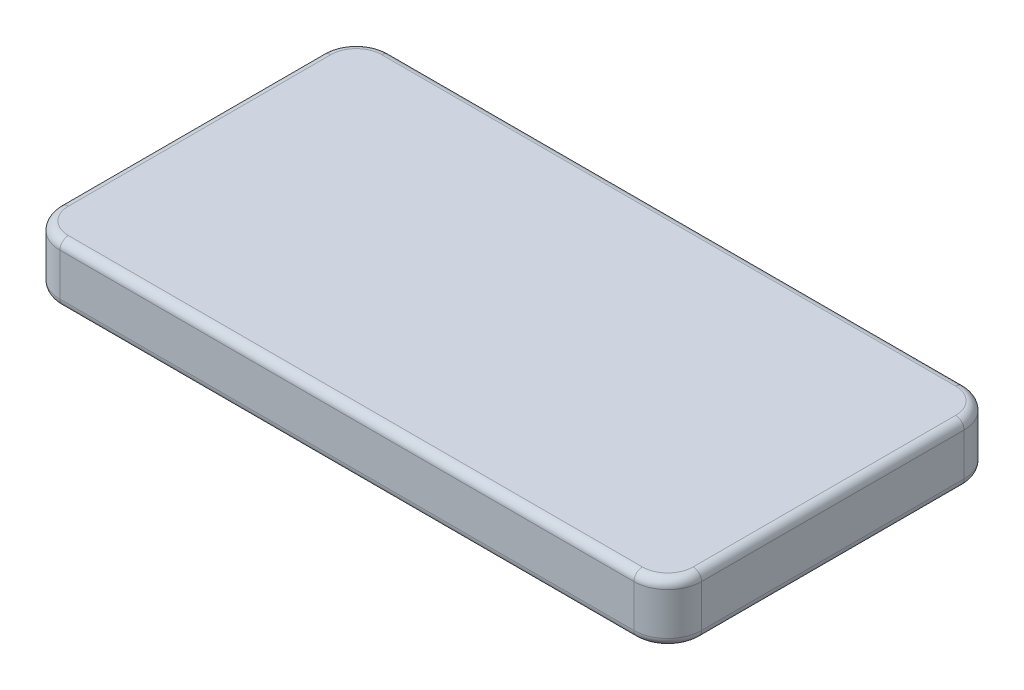
ISO-10303-21;
HEADER;
FILE_DESCRIPTION(('STEP AP214'),'2;1');
FILE_NAME('part.step','',(''),(''),'','','');
FILE_SCHEMA(('AUTOMOTIVE_DESIGN { 1 0 10303 214 1 1 1 1 }'));
ENDSEC;
DATA;
#1=APPLICATION_CONTEXT('core data for automotive mechanical design processes');
#2=APPLICATION_PROTOCOL_DEFINITION('international standard','automotive_design',2000,#1);
#3=PRODUCT_CONTEXT('',#1,'mechanical');
#4=PRODUCT('Part','Part','',(#3));
#5=PRODUCT_RELATED_PRODUCT_CATEGORY('part','',(#4));
#6=PRODUCT_DEFINITION_FORMATION('','',#4);
#7=PRODUCT_DEFINITION_CONTEXT('part definition',#1,'design');
#8=PRODUCT_DEFINITION('design','',#6,#7);
#9=PRODUCT_DEFINITION_SHAPE('','',#8);
#10=(LENGTH_UNIT() NAMED_UNIT(*) SI_UNIT(.MILLI.,.METRE.));
#11=(NAMED_UNIT(*) PLANE_ANGLE_UNIT() SI_UNIT($,.RADIAN.));
#12=(NAMED_UNIT(*) SI_UNIT($,.STERADIAN.) SOLID_ANGLE_UNIT());
#13=UNCERTAINTY_MEASURE_WITH_UNIT(LENGTH_MEASURE(1.E-05),#10,'distance_accuracy_value','');
#14=(GEOMETRIC_REPRESENTATION_CONTEXT(3) GLOBAL_UNCERTAINTY_ASSIGNED_CONTEXT((#13)) GLOBAL_UNIT_ASSIGNED_CONTEXT((#10,
#11,#12)) REPRESENTATION_CONTEXT('',''));
#15=CARTESIAN_POINT('',(0.,0.,0.));
#16=DIRECTION('',(0.,0.,1.));
#17=DIRECTION('',(1.,0.,0.));
#18=AXIS2_PLACEMENT_3D('',#15,#16,#17);
#19=CARTESIAN_POINT('',(48.133,4.445,24.765));
#20=DIRECTION('',(-1.,0.,0.));
#21=DIRECTION('',(0.,0.,1.));
#22=AXIS2_PLACEMENT_3D('',#19,#20,#21);
#23=PLANE('',#22);
#24=DIRECTION('',(0.,-1.,0.));
#25=VECTOR('',#24,1.);
#26=CARTESIAN_POINT('',(48.133,4.445,19.685));
#27=LINE('',#26,#25);
#28=CARTESIAN_POINT('',(48.133,3.175,19.685));
#29=VERTEX_POINT('',#28);
#30=CARTESIAN_POINT('',(48.133,-3.175,19.685));
#31=VERTEX_POINT('',#30);
#32=EDGE_CURVE('E350',#29,#31,#27,.T.);
#33=ORIENTED_EDGE('',*,*,#32,.T.);
#34=DIRECTION('',(0.,0.,-1.));
#35=VECTOR('',#34,1.);
#36=CARTESIAN_POINT('',(48.133,-3.175,-19.685));
#37=LINE('',#36,#35);
#38=CARTESIAN_POINT('',(48.133,-3.175,-19.685));
#39=VERTEX_POINT('',#38);
#40=EDGE_CURVE('E208',#31,#39,#37,.T.);
#41=ORIENTED_EDGE('',*,*,#40,.T.);
#42=DIRECTION('',(0.,-1.,0.));
#43=VECTOR('',#42,1.);
#44=CARTESIAN_POINT('',(48.133,4.445,-19.685));
#45=LINE('',#44,#43);
#46=CARTESIAN_POINT('',(48.133,3.175,-19.685));
#47=VERTEX_POINT('',#46);
#48=EDGE_CURVE('E175',#39,#47,#45,.F.);
#49=ORIENTED_EDGE('',*,*,#48,.T.);
#50=DIRECTION('',(0.,0.,-1.));
#51=VECTOR('',#50,1.);
#52=CARTESIAN_POINT('',(48.133,3.175,24.765));
#53=LINE('',#52,#51);
#54=EDGE_CURVE('E205',#47,#29,#53,.F.);
#55=ORIENTED_EDGE('',*,*,#54,.T.);
#56=EDGE_LOOP('',(#33,#41,#49,#55));
#57=FACE_BOUND('',#56,.T.);
#58=ADVANCED_FACE('F39',(#57),#23,.F.);
#59=CARTESIAN_POINT('',(-48.133,4.445,-24.765));
#60=DIRECTION('',(0.,0.,1.));
#61=DIRECTION('',(1.,0.,0.));
#62=AXIS2_PLACEMENT_3D('',#59,#60,#61);
#63=PLANE('',#62);
#64=DIRECTION('',(0.,-1.,0.));
#65=VECTOR('',#64,1.);
#66=CARTESIAN_POINT('',(43.053,4.445,-24.765));
#67=LINE('',#66,#65);
#68=CARTESIAN_POINT('',(43.053,3.175,-24.765));
#69=VERTEX_POINT('',#68);
#70=CARTESIAN_POINT('',(43.053,-3.175,-24.765));
#71=VERTEX_POINT('',#70);
#72=EDGE_CURVE('E334',#69,#71,#67,.T.);
#73=ORIENTED_EDGE('',*,*,#72,.T.);
#74=DIRECTION('',(-1.,0.,0.));
#75=VECTOR('',#74,1.);
#76=CARTESIAN_POINT('',(-43.053,-3.175,-24.765));
#77=LINE('',#76,#75);
#78=CARTESIAN_POINT('',(-43.053,-3.175,-24.765));
#79=VERTEX_POINT('',#78);
#80=EDGE_CURVE('E221',#71,#79,#77,.T.);
#81=ORIENTED_EDGE('',*,*,#80,.T.);
#82=DIRECTION('',(0.,-1.,0.));
#83=VECTOR('',#82,1.);
#84=CARTESIAN_POINT('',(-43.053,4.445,-24.765));
#85=LINE('',#84,#83);
#86=CARTESIAN_POINT('',(-43.053,3.175,-24.765));
#87=VERTEX_POINT('',#86);
#88=EDGE_CURVE('E340',#79,#87,#85,.F.);
#89=ORIENTED_EDGE('',*,*,#88,.T.);
#90=DIRECTION('',(-1.,0.,0.));
#91=VECTOR('',#90,1.);
#92=CARTESIAN_POINT('',(-48.133,3.175,-24.765));
#93=LINE('',#92,#91);
#94=EDGE_CURVE('E218',#87,#69,#93,.F.);
#95=ORIENTED_EDGE('',*,*,#94,.T.);
#96=EDGE_LOOP('',(#73,#81,#89,#95));
#97=FACE_BOUND('',#96,.T.);
#98=ADVANCED_FACE('F408',(#97),#63,.F.);
#99=CARTESIAN_POINT('',(-48.133,4.445,24.765));
#100=DIRECTION('',(1.,0.,0.));
#101=DIRECTION('',(0.,0.,-1.));
#102=AXIS2_PLACEMENT_3D('',#99,#100,#101);
#103=PLANE('',#102);
#104=DIRECTION('',(0.,-1.,0.));
#105=VECTOR('',#104,1.);
#106=CARTESIAN_POINT('',(-48.133,4.445,-19.685));
#107=LINE('',#106,#105);
#108=CARTESIAN_POINT('',(-48.133,3.175,-19.685));
#109=VERTEX_POINT('',#108);
#110=CARTESIAN_POINT('',(-48.133,-3.175,-19.685));
#111=VERTEX_POINT('',#110);
#112=EDGE_CURVE('E331',#109,#111,#107,.T.);
#113=ORIENTED_EDGE('',*,*,#112,.T.);
#114=DIRECTION('',(0.,0.,1.));
#115=VECTOR('',#114,1.);
#116=CARTESIAN_POINT('',(-48.133,-3.175,19.685));
#117=LINE('',#116,#115);
#118=CARTESIAN_POINT('',(-48.133,-3.175,19.685));
#119=VERTEX_POINT('',#118);
#120=EDGE_CURVE('E233',#111,#119,#117,.T.);
#121=ORIENTED_EDGE('',*,*,#120,.T.);
#122=DIRECTION('',(0.,-1.,0.));
#123=VECTOR('',#122,1.);
#124=CARTESIAN_POINT('',(-48.133,4.445,19.685));
#125=LINE('',#124,#123);
#126=CARTESIAN_POINT('',(-48.133,3.175,19.685));
#127=VERTEX_POINT('',#126);
#128=EDGE_CURVE('E279',#119,#127,#125,.F.);
#129=ORIENTED_EDGE('',*,*,#128,.T.);
#130=DIRECTION('',(0.,0.,1.));
#131=VECTOR('',#130,1.);
#132=CARTESIAN_POINT('',(-48.133,3.175,24.765));
#133=LINE('',#132,#131);
#134=EDGE_CURVE('E230',#127,#109,#133,.F.);
#135=ORIENTED_EDGE('',*,*,#134,.T.);
#136=EDGE_LOOP('',(#113,#121,#129,#135));
#137=FACE_BOUND('',#136,.T.);
#138=ADVANCED_FACE('F328',(#137),#103,.F.);
#139=CARTESIAN_POINT('',(-48.133,4.445,24.765));
#140=DIRECTION('',(0.,0.,-1.));
#141=DIRECTION('',(-1.,0.,0.));
#142=AXIS2_PLACEMENT_3D('',#139,#140,#141);
#143=PLANE('',#142);
#144=DIRECTION('',(0.,-1.,0.));
#145=VECTOR('',#144,1.);
#146=CARTESIAN_POINT('',(-43.053,4.445,24.765));
#147=LINE('',#146,#145);
#148=CARTESIAN_POINT('',(-43.053,3.175,24.765));
#149=VERTEX_POINT('',#148);
#150=CARTESIAN_POINT('',(-43.053,-3.175,24.765));
#151=VERTEX_POINT('',#150);
#152=EDGE_CURVE('E325',#149,#151,#147,.T.);
#153=ORIENTED_EDGE('',*,*,#152,.T.);
#154=DIRECTION('',(1.,0.,0.));
#155=VECTOR('',#154,1.);
#156=CARTESIAN_POINT('',(43.053,-3.175,24.765));
#157=LINE('',#156,#155);
#158=CARTESIAN_POINT('',(43.053,-3.175,24.765));
#159=VERTEX_POINT('',#158);
#160=EDGE_CURVE('E196',#151,#159,#157,.T.);
#161=ORIENTED_EDGE('',*,*,#160,.T.);
#162=DIRECTION('',(0.,-1.,0.));
#163=VECTOR('',#162,1.);
#164=CARTESIAN_POINT('',(43.053,4.445,24.765));
#165=LINE('',#164,#163);
#166=CARTESIAN_POINT('',(43.053,3.175,24.765));
#167=VERTEX_POINT('',#166);
#168=EDGE_CURVE('E344',#159,#167,#165,.F.);
#169=ORIENTED_EDGE('',*,*,#168,.T.);
#170=DIRECTION('',(1.,0.,0.));
#171=VECTOR('',#170,1.);
#172=CARTESIAN_POINT('',(-48.133,3.175,24.765));
#173=LINE('',#172,#171);
#174=EDGE_CURVE('E193',#167,#149,#173,.F.);
#175=ORIENTED_EDGE('',*,*,#174,.T.);
#176=EDGE_LOOP('',(#153,#161,#169,#175));
#177=FACE_BOUND('',#176,.T.);
#178=ADVANCED_FACE('F380',(#177),#143,.F.);
#179=CARTESIAN_POINT('',(0.,4.445,0.));
#180=DIRECTION('',(0.,-1.,0.));
#181=DIRECTION('',(0.,0.,-1.));
#182=AXIS2_PLACEMENT_3D('',#179,#180,#181);
#183=PLANE('',#182);
#184=DIRECTION('',(0.,0.,-1.));
#185=VECTOR('',#184,1.);
#186=CARTESIAN_POINT('',(46.863,4.445,0.));
#187=LINE('',#186,#185);
#188=CARTESIAN_POINT('',(46.863,4.445,19.685));
#189=VERTEX_POINT('',#188);
#190=CARTESIAN_POINT('',(46.863,4.445,-19.685));
#191=VERTEX_POINT('',#190);
#192=EDGE_CURVE('E49',#189,#191,#187,.T.);
#193=ORIENTED_EDGE('',*,*,#192,.T.);
#194=CARTESIAN_POINT('',(43.053,4.445,-19.685));
#195=DIRECTION('',(0.,-1.,0.));
#196=DIRECTION('',(0.,0.,-1.));
#197=AXIS2_PLACEMENT_3D('',#194,#195,#196);
#198=CIRCLE('',#197,3.81);
#199=CARTESIAN_POINT('',(43.053,4.445,-23.495));
#200=VERTEX_POINT('',#199);
#201=EDGE_CURVE('E11',#191,#200,#198,.F.);
#202=ORIENTED_EDGE('',*,*,#201,.T.);
#203=DIRECTION('',(-1.,0.,0.));
#204=VECTOR('',#203,1.);
#205=CARTESIAN_POINT('',(0.,4.445,-23.495));
#206=LINE('',#205,#204);
#207=CARTESIAN_POINT('',(-43.053,4.445,-23.495));
#208=VERTEX_POINT('',#207);
#209=EDGE_CURVE('E236',#200,#208,#206,.T.);
#210=ORIENTED_EDGE('',*,*,#209,.T.);
#211=CARTESIAN_POINT('',(-43.053,4.445,-19.685));
#212=DIRECTION('',(0.,-1.,0.));
#213=DIRECTION('',(0.,0.,-1.));
#214=AXIS2_PLACEMENT_3D('',#211,#212,#213);
#215=CIRCLE('',#214,3.81);
#216=CARTESIAN_POINT('',(-46.863,4.445,-19.685));
#217=VERTEX_POINT('',#216);
#218=EDGE_CURVE('E239',#208,#217,#215,.F.);
#219=ORIENTED_EDGE('',*,*,#218,.T.);
#220=DIRECTION('',(0.,0.,1.));
#221=VECTOR('',#220,1.);
#222=CARTESIAN_POINT('',(-46.863,4.445,0.));
#223=LINE('',#222,#221);
#224=CARTESIAN_POINT('',(-46.863,4.445,19.685));
#225=VERTEX_POINT('',#224);
#226=EDGE_CURVE('E242',#217,#225,#223,.T.);
#227=ORIENTED_EDGE('',*,*,#226,.T.);
#228=CARTESIAN_POINT('',(-43.053,4.445,19.685));
#229=DIRECTION('',(0.,-1.,0.));
#230=DIRECTION('',(0.,0.,-1.));
#231=AXIS2_PLACEMENT_3D('',#228,#229,#230);
#232=CIRCLE('',#231,3.81);
#233=CARTESIAN_POINT('',(-43.053,4.445,23.495));
#234=VERTEX_POINT('',#233);
#235=EDGE_CURVE('E245',#225,#234,#232,.F.);
#236=ORIENTED_EDGE('',*,*,#235,.T.);
#237=DIRECTION('',(1.,0.,0.));
#238=VECTOR('',#237,1.);
#239=CARTESIAN_POINT('',(0.,4.445,23.495));
#240=LINE('',#239,#238);
#241=CARTESIAN_POINT('',(43.053,4.445,23.495));
#242=VERTEX_POINT('',#241);
#243=EDGE_CURVE('E248',#234,#242,#240,.T.);
#244=ORIENTED_EDGE('',*,*,#243,.T.);
#245=CARTESIAN_POINT('',(43.053,4.445,19.685));
#246=DIRECTION('',(0.,-1.,0.));
#247=DIRECTION('',(0.,0.,-1.));
#248=AXIS2_PLACEMENT_3D('',#245,#246,#247);
#249=CIRCLE('',#248,3.81);
#250=EDGE_CURVE('E60',#242,#189,#249,.F.);
#251=ORIENTED_EDGE('',*,*,#250,.T.);
#252=EDGE_LOOP('',(#193,#202,#210,#219,#227,#236,#244,#251));
#253=FACE_BOUND('',#252,.T.);
#254=ADVANCED_FACE('F396',(#253),#183,.F.);
#255=CARTESIAN_POINT('',(0.,-4.445,0.));
#256=DIRECTION('',(0.,-1.,0.));
#257=DIRECTION('',(0.,0.,-1.));
#258=AXIS2_PLACEMENT_3D('',#255,#256,#257);
#259=PLANE('',#258);
#260=DIRECTION('',(1.,0.,0.));
#261=VECTOR('',#260,1.);
#262=CARTESIAN_POINT('',(-43.053,-4.445,23.495));
#263=LINE('',#262,#261);
#264=CARTESIAN_POINT('',(43.053,-4.445,23.495));
#265=VERTEX_POINT('',#264);
#266=CARTESIAN_POINT('',(-43.053,-4.445,23.495));
#267=VERTEX_POINT('',#266);
#268=EDGE_CURVE('E179',#265,#267,#263,.F.);
#269=ORIENTED_EDGE('',*,*,#268,.T.);
#270=CARTESIAN_POINT('',(-43.053,-4.445,19.685));
#271=DIRECTION('',(0.,-1.,0.));
#272=DIRECTION('',(0.,0.,-1.));
#273=AXIS2_PLACEMENT_3D('',#270,#271,#272);
#274=CIRCLE('',#273,3.81);
#275=CARTESIAN_POINT('',(-46.863,-4.445,19.685));
#276=VERTEX_POINT('',#275);
#277=EDGE_CURVE('E158',#267,#276,#274,.T.);
#278=ORIENTED_EDGE('',*,*,#277,.T.);
#279=DIRECTION('',(0.,0.,1.));
#280=VECTOR('',#279,1.);
#281=CARTESIAN_POINT('',(-46.863,-4.445,-19.685));
#282=LINE('',#281,#280);
#283=CARTESIAN_POINT('',(-46.863,-4.445,-19.685));
#284=VERTEX_POINT('',#283);
#285=EDGE_CURVE('E167',#276,#284,#282,.F.);
#286=ORIENTED_EDGE('',*,*,#285,.T.);
#287=CARTESIAN_POINT('',(-43.053,-4.445,-19.685));
#288=DIRECTION('',(0.,-1.,0.));
#289=DIRECTION('',(0.,0.,-1.));
#290=AXIS2_PLACEMENT_3D('',#287,#288,#289);
#291=CIRCLE('',#290,3.81);
#292=CARTESIAN_POINT('',(-43.053,-4.445,-23.495));
#293=VERTEX_POINT('',#292);
#294=EDGE_CURVE('E174',#284,#293,#291,.T.);
#295=ORIENTED_EDGE('',*,*,#294,.T.);
#296=DIRECTION('',(-1.,0.,0.));
#297=VECTOR('',#296,1.);
#298=CARTESIAN_POINT('',(43.053,-4.445,-23.495));
#299=LINE('',#298,#297);
#300=CARTESIAN_POINT('',(43.053,-4.445,-23.495));
#301=VERTEX_POINT('',#300);
#302=EDGE_CURVE('E359',#293,#301,#299,.F.);
#303=ORIENTED_EDGE('',*,*,#302,.T.);
#304=CARTESIAN_POINT('',(43.053,-4.445,-19.685));
#305=DIRECTION('',(0.,-1.,0.));
#306=DIRECTION('',(0.,0.,-1.));
#307=AXIS2_PLACEMENT_3D('',#304,#305,#306);
#308=CIRCLE('',#307,3.81);
#309=CARTESIAN_POINT('',(46.863,-4.445,-19.685));
#310=VERTEX_POINT('',#309);
#311=EDGE_CURVE('E362',#301,#310,#308,.T.);
#312=ORIENTED_EDGE('',*,*,#311,.T.);
#313=DIRECTION('',(0.,0.,-1.));
#314=VECTOR('',#313,1.);
#315=CARTESIAN_POINT('',(46.863,-4.445,19.685));
#316=LINE('',#315,#314);
#317=CARTESIAN_POINT('',(46.863,-4.445,19.685));
#318=VERTEX_POINT('',#317);
#319=EDGE_CURVE('E365',#310,#318,#316,.F.);
#320=ORIENTED_EDGE('',*,*,#319,.T.);
#321=CARTESIAN_POINT('',(43.053,-4.445,19.685));
#322=DIRECTION('',(0.,-1.,0.));
#323=DIRECTION('',(0.,0.,-1.));
#324=AXIS2_PLACEMENT_3D('',#321,#322,#323);
#325=CIRCLE('',#324,3.81);
#326=EDGE_CURVE('E187',#318,#265,#325,.T.);
#327=ORIENTED_EDGE('',*,*,#326,.T.);
#328=EDGE_LOOP('',(#269,#278,#286,#295,#303,#312,#320,#327));
#329=FACE_BOUND('',#328,.T.);
#330=ADVANCED_FACE('F177',(#329),#259,.T.);
#331=CARTESIAN_POINT('',(-43.053,4.445,-19.685));
#332=DIRECTION('',(0.,-1.,0.));
#333=DIRECTION('',(0.,0.,-1.));
#334=AXIS2_PLACEMENT_3D('',#331,#332,#333);
#335=CYLINDRICAL_SURFACE('',#334,5.08);
#336=ORIENTED_EDGE('',*,*,#88,.F.);
#337=CARTESIAN_POINT('',(-43.053,-3.175,-19.685));
#338=DIRECTION('',(0.,-1.,0.));
#339=DIRECTION('',(0.,0.,-1.));
#340=AXIS2_PLACEMENT_3D('',#337,#338,#339);
#341=CIRCLE('',#340,5.08);
#342=EDGE_CURVE('E227',#79,#111,#341,.F.);
#343=ORIENTED_EDGE('',*,*,#342,.T.);
#344=ORIENTED_EDGE('',*,*,#112,.F.);
#345=CARTESIAN_POINT('',(-43.053,3.175,-19.685));
#346=DIRECTION('',(0.,-1.,0.));
#347=DIRECTION('',(0.,0.,-1.));
#348=AXIS2_PLACEMENT_3D('',#345,#346,#347);
#349=CIRCLE('',#348,5.08);
#350=EDGE_CURVE('E224',#109,#87,#349,.T.);
#351=ORIENTED_EDGE('',*,*,#350,.T.);
#352=EDGE_LOOP('',(#336,#343,#344,#351));
#353=FACE_BOUND('',#352,.T.);
#354=ADVANCED_FACE('F432',(#353),#335,.T.);
#355=CARTESIAN_POINT('',(-43.053,4.445,19.685));
#356=DIRECTION('',(0.,-1.,0.));
#357=DIRECTION('',(0.,0.,-1.));
#358=AXIS2_PLACEMENT_3D('',#355,#356,#357);
#359=CYLINDRICAL_SURFACE('',#358,5.08);
#360=ORIENTED_EDGE('',*,*,#128,.F.);
#361=CARTESIAN_POINT('',(-43.053,-3.175,19.685));
#362=DIRECTION('',(0.,-1.,0.));
#363=DIRECTION('',(0.,0.,-1.));
#364=AXIS2_PLACEMENT_3D('',#361,#362,#363);
#365=CIRCLE('',#364,5.08);
#366=EDGE_CURVE('E160',#119,#151,#365,.F.);
#367=ORIENTED_EDGE('',*,*,#366,.T.);
#368=ORIENTED_EDGE('',*,*,#152,.F.);
#369=CARTESIAN_POINT('',(-43.053,3.175,19.685));
#370=DIRECTION('',(0.,-1.,0.));
#371=DIRECTION('',(0.,0.,-1.));
#372=AXIS2_PLACEMENT_3D('',#369,#370,#371);
#373=CIRCLE('',#372,5.08);
#374=EDGE_CURVE('E182',#149,#127,#373,.T.);
#375=ORIENTED_EDGE('',*,*,#374,.T.);
#376=EDGE_LOOP('',(#360,#367,#368,#375));
#377=FACE_BOUND('',#376,.T.);
#378=ADVANCED_FACE('F323',(#377),#359,.T.);
#379=CARTESIAN_POINT('',(43.053,4.445,-19.685));
#380=DIRECTION('',(0.,-1.,0.));
#381=DIRECTION('',(0.,0.,-1.));
#382=AXIS2_PLACEMENT_3D('',#379,#380,#381);
#383=CYLINDRICAL_SURFACE('',#382,5.08);
#384=ORIENTED_EDGE('',*,*,#48,.F.);
#385=CARTESIAN_POINT('',(43.053,-3.175,-19.685));
#386=DIRECTION('',(0.,-1.,0.));
#387=DIRECTION('',(0.,0.,-1.));
#388=AXIS2_PLACEMENT_3D('',#385,#386,#387);
#389=CIRCLE('',#388,5.08);
#390=EDGE_CURVE('E215',#39,#71,#389,.F.);
#391=ORIENTED_EDGE('',*,*,#390,.T.);
#392=ORIENTED_EDGE('',*,*,#72,.F.);
#393=CARTESIAN_POINT('',(43.053,3.175,-19.685));
#394=DIRECTION('',(0.,-1.,0.));
#395=DIRECTION('',(0.,0.,-1.));
#396=AXIS2_PLACEMENT_3D('',#393,#394,#395);
#397=CIRCLE('',#396,5.08);
#398=EDGE_CURVE('E211',#69,#47,#397,.T.);
#399=ORIENTED_EDGE('',*,*,#398,.T.);
#400=EDGE_LOOP('',(#384,#391,#392,#399));
#401=FACE_BOUND('',#400,.T.);
#402=ADVANCED_FACE('F413',(#401),#383,.T.);
#403=CARTESIAN_POINT('',(43.053,4.445,19.685));
#404=DIRECTION('',(0.,-1.,0.));
#405=DIRECTION('',(0.,0.,-1.));
#406=AXIS2_PLACEMENT_3D('',#403,#404,#405);
#407=CYLINDRICAL_SURFACE('',#406,5.08);
#408=ORIENTED_EDGE('',*,*,#168,.F.);
#409=CARTESIAN_POINT('',(43.053,-3.175,19.685));
#410=DIRECTION('',(0.,-1.,0.));
#411=DIRECTION('',(0.,0.,-1.));
#412=AXIS2_PLACEMENT_3D('',#409,#410,#411);
#413=CIRCLE('',#412,5.08);
#414=EDGE_CURVE('E202',#159,#31,#413,.F.);
#415=ORIENTED_EDGE('',*,*,#414,.T.);
#416=ORIENTED_EDGE('',*,*,#32,.F.);
#417=CARTESIAN_POINT('',(43.053,3.175,19.685));
#418=DIRECTION('',(0.,-1.,0.));
#419=DIRECTION('',(0.,0.,-1.));
#420=AXIS2_PLACEMENT_3D('',#417,#418,#419);
#421=CIRCLE('',#420,5.08);
#422=EDGE_CURVE('E199',#29,#167,#421,.T.);
#423=ORIENTED_EDGE('',*,*,#422,.T.);
#424=EDGE_LOOP('',(#408,#415,#416,#423));
#425=FACE_BOUND('',#424,.T.);
#426=ADVANCED_FACE('F382',(#425),#407,.T.);
#427=CARTESIAN_POINT('',(43.053,-3.175,-19.685));
#428=DIRECTION('',(0.,-1.,0.));
#429=DIRECTION('',(0.,0.,-1.));
#430=AXIS2_PLACEMENT_3D('',#427,#428,#429);
#431=TOROIDAL_SURFACE('',#430,3.81,1.27);
#432=CARTESIAN_POINT('',(43.053,-3.175,-23.495));
#433=DIRECTION('',(-1.,0.,0.));
#434=DIRECTION('',(0.,0.,1.));
#435=AXIS2_PLACEMENT_3D('',#432,#433,#434);
#436=CIRCLE('',#435,1.27);
#437=EDGE_CURVE('E271',#71,#301,#436,.T.);
#438=ORIENTED_EDGE('',*,*,#437,.F.);
#439=ORIENTED_EDGE('',*,*,#390,.F.);
#440=CARTESIAN_POINT('',(46.863,-3.175,-19.685));
#441=DIRECTION('',(0.,0.,1.));
#442=DIRECTION('',(1.,0.,0.));
#443=AXIS2_PLACEMENT_3D('',#440,#441,#442);
#444=CIRCLE('',#443,1.27);
#445=EDGE_CURVE('E275',#310,#39,#444,.T.);
#446=ORIENTED_EDGE('',*,*,#445,.F.);
#447=ORIENTED_EDGE('',*,*,#311,.F.);
#448=EDGE_LOOP('',(#438,#439,#446,#447));
#449=FACE_BOUND('',#448,.T.);
#450=ADVANCED_FACE('F417',(#449),#431,.T.);
#451=CARTESIAN_POINT('',(46.863,-3.175,24.765));
#452=DIRECTION('',(0.,0.,1.));
#453=DIRECTION('',(1.,0.,0.));
#454=AXIS2_PLACEMENT_3D('',#451,#452,#453);
#455=CYLINDRICAL_SURFACE('',#454,1.27);
#456=ORIENTED_EDGE('',*,*,#445,.T.);
#457=ORIENTED_EDGE('',*,*,#40,.F.);
#458=CARTESIAN_POINT('',(46.863,-3.175,19.685));
#459=DIRECTION('',(0.,0.,1.));
#460=DIRECTION('',(1.,0.,0.));
#461=AXIS2_PLACEMENT_3D('',#458,#459,#460);
#462=CIRCLE('',#461,1.27);
#463=EDGE_CURVE('E267',#318,#31,#462,.T.);
#464=ORIENTED_EDGE('',*,*,#463,.F.);
#465=ORIENTED_EDGE('',*,*,#319,.F.);
#466=EDGE_LOOP('',(#456,#457,#464,#465));
#467=FACE_BOUND('',#466,.T.);
#468=ADVANCED_FACE('F422',(#467),#455,.T.);
#469=CARTESIAN_POINT('',(-48.133,-3.175,-23.495));
#470=DIRECTION('',(1.,0.,0.));
#471=DIRECTION('',(0.,0.,-1.));
#472=AXIS2_PLACEMENT_3D('',#469,#470,#471);
#473=CYLINDRICAL_SURFACE('',#472,1.27);
#474=ORIENTED_EDGE('',*,*,#437,.T.);
#475=ORIENTED_EDGE('',*,*,#302,.F.);
#476=CARTESIAN_POINT('',(-43.053,-3.175,-23.495));
#477=DIRECTION('',(-1.,0.,0.));
#478=DIRECTION('',(0.,0.,1.));
#479=AXIS2_PLACEMENT_3D('',#476,#477,#478);
#480=CIRCLE('',#479,1.27);
#481=EDGE_CURVE('E263',#79,#293,#480,.T.);
#482=ORIENTED_EDGE('',*,*,#481,.F.);
#483=ORIENTED_EDGE('',*,*,#80,.F.);
#484=EDGE_LOOP('',(#474,#475,#482,#483));
#485=FACE_BOUND('',#484,.T.);
#486=ADVANCED_FACE('F454',(#485),#473,.T.);
#487=CARTESIAN_POINT('',(43.053,-3.175,19.685));
#488=DIRECTION('',(0.,-1.,0.));
#489=DIRECTION('',(0.,0.,-1.));
#490=AXIS2_PLACEMENT_3D('',#487,#488,#489);
#491=TOROIDAL_SURFACE('',#490,3.81,1.27);
#492=ORIENTED_EDGE('',*,*,#463,.T.);
#493=ORIENTED_EDGE('',*,*,#414,.F.);
#494=CARTESIAN_POINT('',(43.053,-3.175,23.495));
#495=DIRECTION('',(-1.,0.,0.));
#496=DIRECTION('',(0.,0.,1.));
#497=AXIS2_PLACEMENT_3D('',#494,#495,#496);
#498=CIRCLE('',#497,1.27);
#499=EDGE_CURVE('E259',#265,#159,#498,.T.);
#500=ORIENTED_EDGE('',*,*,#499,.F.);
#501=ORIENTED_EDGE('',*,*,#326,.F.);
#502=EDGE_LOOP('',(#492,#493,#500,#501));
#503=FACE_BOUND('',#502,.T.);
#504=ADVANCED_FACE('F374',(#503),#491,.T.);
#505=CARTESIAN_POINT('',(-43.053,-3.175,-19.685));
#506=DIRECTION('',(0.,-1.,0.));
#507=DIRECTION('',(0.,0.,-1.));
#508=AXIS2_PLACEMENT_3D('',#505,#506,#507);
#509=TOROIDAL_SURFACE('',#508,3.81,1.27);
#510=ORIENTED_EDGE('',*,*,#481,.T.);
#511=ORIENTED_EDGE('',*,*,#294,.F.);
#512=CARTESIAN_POINT('',(-46.863,-3.175,-19.685));
#513=DIRECTION('',(0.,0.,1.));
#514=DIRECTION('',(1.,0.,0.));
#515=AXIS2_PLACEMENT_3D('',#512,#513,#514);
#516=CIRCLE('',#515,1.27);
#517=EDGE_CURVE('E170',#111,#284,#516,.T.);
#518=ORIENTED_EDGE('',*,*,#517,.F.);
#519=ORIENTED_EDGE('',*,*,#342,.F.);
#520=EDGE_LOOP('',(#510,#511,#518,#519));
#521=FACE_BOUND('',#520,.T.);
#522=ADVANCED_FACE('F448',(#521),#509,.T.);
#523=CARTESIAN_POINT('',(-48.133,-3.175,23.495));
#524=DIRECTION('',(-1.,0.,0.));
#525=DIRECTION('',(0.,0.,1.));
#526=AXIS2_PLACEMENT_3D('',#523,#524,#525);
#527=CYLINDRICAL_SURFACE('',#526,1.27);
#528=ORIENTED_EDGE('',*,*,#499,.T.);
#529=ORIENTED_EDGE('',*,*,#160,.F.);
#530=CARTESIAN_POINT('',(-43.053,-3.175,23.495));
#531=DIRECTION('',(-1.,0.,0.));
#532=DIRECTION('',(0.,0.,1.));
#533=AXIS2_PLACEMENT_3D('',#530,#531,#532);
#534=CIRCLE('',#533,1.27);
#535=EDGE_CURVE('E164',#267,#151,#534,.T.);
#536=ORIENTED_EDGE('',*,*,#535,.F.);
#537=ORIENTED_EDGE('',*,*,#268,.F.);
#538=EDGE_LOOP('',(#528,#529,#536,#537));
#539=FACE_BOUND('',#538,.T.);
#540=ADVANCED_FACE('F377',(#539),#527,.T.);
#541=CARTESIAN_POINT('',(-46.863,-3.175,24.765));
#542=DIRECTION('',(0.,0.,-1.));
#543=DIRECTION('',(-1.,0.,0.));
#544=AXIS2_PLACEMENT_3D('',#541,#542,#543);
#545=CYLINDRICAL_SURFACE('',#544,1.27);
#546=ORIENTED_EDGE('',*,*,#517,.T.);
#547=ORIENTED_EDGE('',*,*,#285,.F.);
#548=CARTESIAN_POINT('',(-46.863,-3.175,19.685));
#549=DIRECTION('',(0.,0.,1.));
#550=DIRECTION('',(1.,0.,0.));
#551=AXIS2_PLACEMENT_3D('',#548,#549,#550);
#552=CIRCLE('',#551,1.27);
#553=EDGE_CURVE('E154',#119,#276,#552,.T.);
#554=ORIENTED_EDGE('',*,*,#553,.F.);
#555=ORIENTED_EDGE('',*,*,#120,.F.);
#556=EDGE_LOOP('',(#546,#547,#554,#555));
#557=FACE_BOUND('',#556,.T.);
#558=ADVANCED_FACE('F168',(#557),#545,.T.);
#559=CARTESIAN_POINT('',(-43.053,-3.175,19.685));
#560=DIRECTION('',(0.,-1.,0.));
#561=DIRECTION('',(0.,0.,-1.));
#562=AXIS2_PLACEMENT_3D('',#559,#560,#561);
#563=TOROIDAL_SURFACE('',#562,3.81,1.27);
#564=ORIENTED_EDGE('',*,*,#535,.T.);
#565=ORIENTED_EDGE('',*,*,#366,.F.);
#566=ORIENTED_EDGE('',*,*,#553,.T.);
#567=ORIENTED_EDGE('',*,*,#277,.F.);
#568=EDGE_LOOP('',(#564,#565,#566,#567));
#569=FACE_BOUND('',#568,.T.);
#570=ADVANCED_FACE('F156',(#569),#563,.T.);
#571=CARTESIAN_POINT('',(-43.053,3.175,19.685));
#572=DIRECTION('',(0.,-1.,0.));
#573=DIRECTION('',(0.,0.,-1.));
#574=AXIS2_PLACEMENT_3D('',#571,#572,#573);
#575=TOROIDAL_SURFACE('',#574,3.81,1.27);
#576=CARTESIAN_POINT('',(-46.863,3.175,19.685));
#577=DIRECTION('',(0.,0.,-1.));
#578=DIRECTION('',(-1.,0.,0.));
#579=AXIS2_PLACEMENT_3D('',#576,#577,#578);
#580=CIRCLE('',#579,1.27);
#581=EDGE_CURVE('E301',#127,#225,#580,.T.);
#582=ORIENTED_EDGE('',*,*,#581,.F.);
#583=ORIENTED_EDGE('',*,*,#374,.F.);
#584=CARTESIAN_POINT('',(-43.053,3.175,23.495));
#585=DIRECTION('',(1.,0.,0.));
#586=DIRECTION('',(0.,0.,-1.));
#587=AXIS2_PLACEMENT_3D('',#584,#585,#586);
#588=CIRCLE('',#587,1.27);
#589=EDGE_CURVE('E43',#234,#149,#588,.T.);
#590=ORIENTED_EDGE('',*,*,#589,.F.);
#591=ORIENTED_EDGE('',*,*,#235,.F.);
#592=EDGE_LOOP('',(#582,#583,#590,#591));
#593=FACE_BOUND('',#592,.T.);
#594=ADVANCED_FACE('F41',(#593),#575,.T.);
#595=CARTESIAN_POINT('',(0.,3.175,23.495));
#596=DIRECTION('',(1.,0.,0.));
#597=DIRECTION('',(0.,0.,-1.));
#598=AXIS2_PLACEMENT_3D('',#595,#596,#597);
#599=CYLINDRICAL_SURFACE('',#598,1.27);
#600=ORIENTED_EDGE('',*,*,#589,.T.);
#601=ORIENTED_EDGE('',*,*,#174,.F.);
#602=CARTESIAN_POINT('',(43.053,3.175,23.495));
#603=DIRECTION('',(1.,0.,0.));
#604=DIRECTION('',(0.,0.,-1.));
#605=AXIS2_PLACEMENT_3D('',#602,#603,#604);
#606=CIRCLE('',#605,1.27);
#607=EDGE_CURVE('E298',#242,#167,#606,.T.);
#608=ORIENTED_EDGE('',*,*,#607,.F.);
#609=ORIENTED_EDGE('',*,*,#243,.F.);
#610=EDGE_LOOP('',(#600,#601,#608,#609));
#611=FACE_BOUND('',#610,.T.);
#612=ADVANCED_FACE('F314',(#611),#599,.T.);
#613=CARTESIAN_POINT('',(-46.863,3.175,0.));
#614=DIRECTION('',(0.,0.,1.));
#615=DIRECTION('',(1.,0.,0.));
#616=AXIS2_PLACEMENT_3D('',#613,#614,#615);
#617=CYLINDRICAL_SURFACE('',#616,1.27);
#618=ORIENTED_EDGE('',*,*,#581,.T.);
#619=ORIENTED_EDGE('',*,*,#226,.F.);
#620=CARTESIAN_POINT('',(-46.863,3.175,-19.685));
#621=DIRECTION('',(0.,0.,-1.));
#622=DIRECTION('',(-1.,0.,0.));
#623=AXIS2_PLACEMENT_3D('',#620,#621,#622);
#624=CIRCLE('',#623,1.27);
#625=EDGE_CURVE('E294',#109,#217,#624,.T.);
#626=ORIENTED_EDGE('',*,*,#625,.F.);
#627=ORIENTED_EDGE('',*,*,#134,.F.);
#628=EDGE_LOOP('',(#618,#619,#626,#627));
#629=FACE_BOUND('',#628,.T.);
#630=ADVANCED_FACE('F472',(#629),#617,.T.);
#631=CARTESIAN_POINT('',(43.053,3.175,19.685));
#632=DIRECTION('',(0.,-1.,0.));
#633=DIRECTION('',(0.,0.,-1.));
#634=AXIS2_PLACEMENT_3D('',#631,#632,#633);
#635=TOROIDAL_SURFACE('',#634,3.81,1.27);
#636=ORIENTED_EDGE('',*,*,#607,.T.);
#637=ORIENTED_EDGE('',*,*,#422,.F.);
#638=CARTESIAN_POINT('',(46.863,3.175,19.685));
#639=DIRECTION('',(0.,0.,-1.));
#640=DIRECTION('',(-1.,0.,0.));
#641=AXIS2_PLACEMENT_3D('',#638,#639,#640);
#642=CIRCLE('',#641,1.27);
#643=EDGE_CURVE('E290',#189,#29,#642,.T.);
#644=ORIENTED_EDGE('',*,*,#643,.F.);
#645=ORIENTED_EDGE('',*,*,#250,.F.);
#646=EDGE_LOOP('',(#636,#637,#644,#645));
#647=FACE_BOUND('',#646,.T.);
#648=ADVANCED_FACE('F386',(#647),#635,.T.);
#649=CARTESIAN_POINT('',(-43.053,3.175,-19.685));
#650=DIRECTION('',(0.,-1.,0.));
#651=DIRECTION('',(0.,0.,-1.));
#652=AXIS2_PLACEMENT_3D('',#649,#650,#651);
#653=TOROIDAL_SURFACE('',#652,3.81,1.27);
#654=ORIENTED_EDGE('',*,*,#625,.T.);
#655=ORIENTED_EDGE('',*,*,#218,.F.);
#656=CARTESIAN_POINT('',(-43.053,3.175,-23.495));
#657=DIRECTION('',(1.,0.,0.));
#658=DIRECTION('',(0.,0.,-1.));
#659=AXIS2_PLACEMENT_3D('',#656,#657,#658);
#660=CIRCLE('',#659,1.27);
#661=EDGE_CURVE('E286',#87,#208,#660,.T.);
#662=ORIENTED_EDGE('',*,*,#661,.F.);
#663=ORIENTED_EDGE('',*,*,#350,.F.);
#664=EDGE_LOOP('',(#654,#655,#662,#663));
#665=FACE_BOUND('',#664,.T.);
#666=ADVANCED_FACE('F401',(#665),#653,.T.);
#667=CARTESIAN_POINT('',(46.863,3.175,0.));
#668=DIRECTION('',(0.,0.,-1.));
#669=DIRECTION('',(-1.,0.,0.));
#670=AXIS2_PLACEMENT_3D('',#667,#668,#669);
#671=CYLINDRICAL_SURFACE('',#670,1.27);
#672=ORIENTED_EDGE('',*,*,#643,.T.);
#673=ORIENTED_EDGE('',*,*,#54,.F.);
#674=CARTESIAN_POINT('',(46.863,3.175,-19.685));
#675=DIRECTION('',(0.,0.,-1.));
#676=DIRECTION('',(-1.,0.,0.));
#677=AXIS2_PLACEMENT_3D('',#674,#675,#676);
#678=CIRCLE('',#677,1.27);
#679=EDGE_CURVE('E283',#191,#47,#678,.T.);
#680=ORIENTED_EDGE('',*,*,#679,.F.);
#681=ORIENTED_EDGE('',*,*,#192,.F.);
#682=EDGE_LOOP('',(#672,#673,#680,#681));
#683=FACE_BOUND('',#682,.T.);
#684=ADVANCED_FACE('F389',(#683),#671,.T.);
#685=CARTESIAN_POINT('',(0.,3.175,-23.495));
#686=DIRECTION('',(-1.,0.,0.));
#687=DIRECTION('',(0.,0.,1.));
#688=AXIS2_PLACEMENT_3D('',#685,#686,#687);
#689=CYLINDRICAL_SURFACE('',#688,1.27);
#690=ORIENTED_EDGE('',*,*,#661,.T.);
#691=ORIENTED_EDGE('',*,*,#209,.F.);
#692=CARTESIAN_POINT('',(43.053,3.175,-23.495));
#693=DIRECTION('',(1.,0.,0.));
#694=DIRECTION('',(0.,0.,-1.));
#695=AXIS2_PLACEMENT_3D('',#692,#693,#694);
#696=CIRCLE('',#695,1.27);
#697=EDGE_CURVE('E280',#69,#200,#696,.T.);
#698=ORIENTED_EDGE('',*,*,#697,.F.);
#699=ORIENTED_EDGE('',*,*,#94,.F.);
#700=EDGE_LOOP('',(#690,#691,#698,#699));
#701=FACE_BOUND('',#700,.T.);
#702=ADVANCED_FACE('F405',(#701),#689,.T.);
#703=CARTESIAN_POINT('',(43.053,3.175,-19.685));
#704=DIRECTION('',(0.,-1.,0.));
#705=DIRECTION('',(0.,0.,-1.));
#706=AXIS2_PLACEMENT_3D('',#703,#704,#705);
#707=TOROIDAL_SURFACE('',#706,3.81,1.27);
#708=ORIENTED_EDGE('',*,*,#679,.T.);
#709=ORIENTED_EDGE('',*,*,#398,.F.);
#710=ORIENTED_EDGE('',*,*,#697,.T.);
#711=ORIENTED_EDGE('',*,*,#201,.F.);
#712=EDGE_LOOP('',(#708,#709,#710,#711));
#713=FACE_BOUND('',#712,.T.);
#714=ADVANCED_FACE('F393',(#713),#707,.T.);
#715=CLOSED_SHELL('',(#58,#98,#138,#178,#254,#330,#354,#378,#402,#426,#450,#468,#486,#504,#522,
#540,#558,#570,#594,#612,#630,#648,#666,#684,#702,#714));
#716=MANIFOLD_SOLID_BREP('B2',#715);
#717=ADVANCED_BREP_SHAPE_REPRESENTATION('',(#18,#716),#14);
#718=SHAPE_DEFINITION_REPRESENTATION(#9,#717);
ENDSEC;
END-ISO-10303-21;
